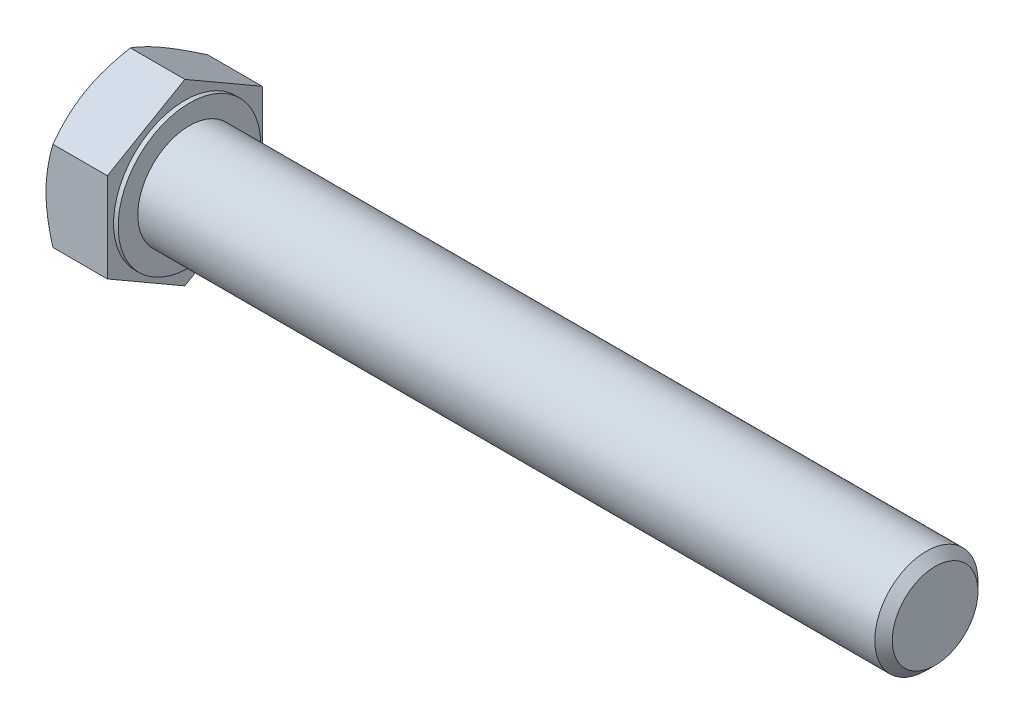
ISO-10303-21;
HEADER;
FILE_DESCRIPTION(('STEP AP214'),'2;1');
FILE_NAME('part.step','',(''),(''),'','','');
FILE_SCHEMA(('AUTOMOTIVE_DESIGN { 1 0 10303 214 1 1 1 1 }'));
ENDSEC;
DATA;
#1=APPLICATION_CONTEXT('core data for automotive mechanical design processes');
#2=APPLICATION_PROTOCOL_DEFINITION('international standard','automotive_design',2000,#1);
#3=PRODUCT_CONTEXT('',#1,'mechanical');
#4=PRODUCT('Part','Part','',(#3));
#5=PRODUCT_RELATED_PRODUCT_CATEGORY('part','',(#4));
#6=PRODUCT_DEFINITION_FORMATION('','',#4);
#7=PRODUCT_DEFINITION_CONTEXT('part definition',#1,'design');
#8=PRODUCT_DEFINITION('design','',#6,#7);
#9=PRODUCT_DEFINITION_SHAPE('','',#8);
#10=(LENGTH_UNIT() NAMED_UNIT(*) SI_UNIT(.MILLI.,.METRE.));
#11=(NAMED_UNIT(*) PLANE_ANGLE_UNIT() SI_UNIT($,.RADIAN.));
#12=(NAMED_UNIT(*) SI_UNIT($,.STERADIAN.) SOLID_ANGLE_UNIT());
#13=UNCERTAINTY_MEASURE_WITH_UNIT(LENGTH_MEASURE(1.E-05),#10,'distance_accuracy_value','');
#14=(GEOMETRIC_REPRESENTATION_CONTEXT(3) GLOBAL_UNCERTAINTY_ASSIGNED_CONTEXT((#13)) GLOBAL_UNIT_ASSIGNED_CONTEXT((#10,
#11,#12)) REPRESENTATION_CONTEXT('',''));
#15=CARTESIAN_POINT('',(0.,0.,0.));
#16=DIRECTION('',(0.,0.,1.));
#17=DIRECTION('',(1.,0.,0.));
#18=AXIS2_PLACEMENT_3D('',#15,#16,#17);
#19=CARTESIAN_POINT('',(-11.5,0.,0.));
#20=DIRECTION('',(1.,0.,0.));
#21=DIRECTION('',(0.,0.,-1.));
#22=AXIS2_PLACEMENT_3D('',#19,#20,#21);
#23=CONICAL_SURFACE('',#22,13.5,1.0471975511966);
#24=CARTESIAN_POINT('',(-10.2942286340602,-15.5884572681199,0.));
#25=CARTESIAN_POINT('',(-11.5,-13.5000000000005,-3.61731409781927));
#26=CARTESIAN_POINT('',(-11.5,-11.6913429510899,-6.75000000000001));
#27=B_SPLINE_CURVE_WITH_KNOTS('',2,(#24,#25,#26),.UNSPECIFIED.,.F.,.F.,(3,3),(0.,1.),.UNSPECIFIED.);
#28=CARTESIAN_POINT('',(-10.29422863406,-15.5884572681199,0.));
#29=VERTEX_POINT('',#28);
#30=CARTESIAN_POINT('',(-11.5,-11.6913429510899,-6.75));
#31=VERTEX_POINT('',#30);
#32=EDGE_CURVE('E417',#29,#31,#27,.T.);
#33=ORIENTED_EDGE('',*,*,#32,.F.);
#34=CARTESIAN_POINT('',(-11.5,-11.6913429510899,6.75));
#35=CARTESIAN_POINT('',(-11.5,-13.5000000000003,3.6173140978196));
#36=CARTESIAN_POINT('',(-10.2942286340601,-15.5884572681199,0.));
#37=B_SPLINE_CURVE_WITH_KNOTS('',2,(#34,#35,#36),.UNSPECIFIED.,.F.,.F.,(3,3),(0.,1.),.UNSPECIFIED.);
#38=CARTESIAN_POINT('',(-11.5,-11.6913429510899,6.75));
#39=VERTEX_POINT('',#38);
#40=EDGE_CURVE('E95',#39,#29,#37,.T.);
#41=ORIENTED_EDGE('',*,*,#40,.F.);
#42=CARTESIAN_POINT('',(-11.5,0.,0.));
#43=DIRECTION('',(1.,0.,0.));
#44=DIRECTION('',(0.,0.,-1.));
#45=AXIS2_PLACEMENT_3D('',#42,#43,#44);
#46=CIRCLE('',#45,13.5);
#47=EDGE_CURVE('E10',#39,#31,#46,.T.);
#48=ORIENTED_EDGE('',*,*,#47,.T.);
#49=EDGE_LOOP('',(#33,#41,#48));
#50=FACE_BOUND('',#49,.T.);
#51=ADVANCED_FACE('F16',(#50),#23,.T.);
#52=CARTESIAN_POINT('',(-11.5,0.,0.));
#53=DIRECTION('',(1.,0.,0.));
#54=DIRECTION('',(0.,1.,0.));
#55=AXIS2_PLACEMENT_3D('',#52,#53,#54);
#56=PLANE('',#55);
#57=CARTESIAN_POINT('',(-11.5,0.,0.));
#58=DIRECTION('',(1.,0.,0.));
#59=DIRECTION('',(0.,0.,-1.));
#60=AXIS2_PLACEMENT_3D('',#57,#58,#59);
#61=CIRCLE('',#60,13.5);
#62=CARTESIAN_POINT('',(-11.5,11.6913429510899,-6.75));
#63=VERTEX_POINT('',#62);
#64=CARTESIAN_POINT('',(-11.5,11.6913429510899,6.75));
#65=VERTEX_POINT('',#64);
#66=EDGE_CURVE('E30',#63,#65,#61,.T.);
#67=ORIENTED_EDGE('',*,*,#66,.F.);
#68=CARTESIAN_POINT('',(-11.5,0.,0.));
#69=DIRECTION('',(1.,0.,0.));
#70=DIRECTION('',(0.,0.,-1.));
#71=AXIS2_PLACEMENT_3D('',#68,#69,#70);
#72=CIRCLE('',#71,13.5);
#73=CARTESIAN_POINT('',(-11.5,0.,-13.5));
#74=VERTEX_POINT('',#73);
#75=EDGE_CURVE('E106',#74,#63,#72,.T.);
#76=ORIENTED_EDGE('',*,*,#75,.F.);
#77=CARTESIAN_POINT('',(-11.5,0.,0.));
#78=DIRECTION('',(1.,0.,0.));
#79=DIRECTION('',(0.,0.,-1.));
#80=AXIS2_PLACEMENT_3D('',#77,#78,#79);
#81=CIRCLE('',#80,13.5);
#82=EDGE_CURVE('E425',#31,#74,#81,.T.);
#83=ORIENTED_EDGE('',*,*,#82,.F.);
#84=ORIENTED_EDGE('',*,*,#47,.F.);
#85=CARTESIAN_POINT('',(-11.5,0.,0.));
#86=DIRECTION('',(1.,0.,0.));
#87=DIRECTION('',(0.,0.,-1.));
#88=AXIS2_PLACEMENT_3D('',#85,#86,#87);
#89=CIRCLE('',#88,13.5);
#90=CARTESIAN_POINT('',(-11.5,0.,13.5));
#91=VERTEX_POINT('',#90);
#92=EDGE_CURVE('E427',#91,#39,#89,.T.);
#93=ORIENTED_EDGE('',*,*,#92,.F.);
#94=CARTESIAN_POINT('',(-11.5,0.,0.));
#95=DIRECTION('',(1.,0.,0.));
#96=DIRECTION('',(0.,0.,-1.));
#97=AXIS2_PLACEMENT_3D('',#94,#95,#96);
#98=CIRCLE('',#97,13.5);
#99=EDGE_CURVE('E360',#65,#91,#98,.T.);
#100=ORIENTED_EDGE('',*,*,#99,.F.);
#101=EDGE_LOOP('',(#67,#76,#83,#84,#93,#100));
#102=FACE_BOUND('',#101,.T.);
#103=ADVANCED_FACE('F204',(#102),#56,.F.);
#104=CARTESIAN_POINT('',(-11.5,0.,0.));
#105=DIRECTION('',(1.,0.,0.));
#106=DIRECTION('',(0.,0.,-1.));
#107=AXIS2_PLACEMENT_3D('',#104,#105,#106);
#108=CONICAL_SURFACE('',#107,13.5,1.0471975511966);
#109=CARTESIAN_POINT('',(-10.2942286340602,15.5884572681199,0.));
#110=CARTESIAN_POINT('',(-11.5,13.5000000000005,3.61731409781927));
#111=CARTESIAN_POINT('',(-11.5,11.6913429510899,6.75000000000001));
#112=B_SPLINE_CURVE_WITH_KNOTS('',2,(#109,#110,#111),.UNSPECIFIED.,.F.,.F.,(3,3),(0.,1.),.UNSPECIFIED.);
#113=CARTESIAN_POINT('',(-10.29422863406,15.5884572681199,0.));
#114=VERTEX_POINT('',#113);
#115=EDGE_CURVE('E313',#114,#65,#112,.T.);
#116=ORIENTED_EDGE('',*,*,#115,.F.);
#117=CARTESIAN_POINT('',(-11.5,11.6913429510899,-6.75));
#118=CARTESIAN_POINT('',(-11.5,13.5000000000003,-3.6173140978196));
#119=CARTESIAN_POINT('',(-10.2942286340601,15.5884572681199,0.));
#120=B_SPLINE_CURVE_WITH_KNOTS('',2,(#117,#118,#119),.UNSPECIFIED.,.F.,.F.,(3,3),(0.,1.),.UNSPECIFIED.);
#121=EDGE_CURVE('E454',#63,#114,#120,.T.);
#122=ORIENTED_EDGE('',*,*,#121,.F.);
#123=ORIENTED_EDGE('',*,*,#66,.T.);
#124=EDGE_LOOP('',(#116,#122,#123));
#125=FACE_BOUND('',#124,.T.);
#126=ADVANCED_FACE('F254',(#125),#108,.T.);
#127=CARTESIAN_POINT('',(-11.5,0.,0.));
#128=DIRECTION('',(1.,0.,0.));
#129=DIRECTION('',(0.,0.,-1.));
#130=AXIS2_PLACEMENT_3D('',#127,#128,#129);
#131=CONICAL_SURFACE('',#130,13.5,1.0471975511966);
#132=CARTESIAN_POINT('',(-10.2942286340602,7.79422863405995,-13.5));
#133=CARTESIAN_POINT('',(-11.5,9.88268590217932,-9.88268590218075));
#134=CARTESIAN_POINT('',(-11.5,11.6913429510899,-6.75));
#135=B_SPLINE_CURVE_WITH_KNOTS('',2,(#132,#133,#134),.UNSPECIFIED.,.F.,.F.,(3,3),(0.,1.),.UNSPECIFIED.);
#136=CARTESIAN_POINT('',(-10.29422863406,7.79422863405995,-13.5));
#137=VERTEX_POINT('',#136);
#138=EDGE_CURVE('E480',#137,#63,#135,.T.);
#139=ORIENTED_EDGE('',*,*,#138,.F.);
#140=CARTESIAN_POINT('',(-11.5,0.,-13.5));
#141=CARTESIAN_POINT('',(-11.5,3.61731409782019,-13.5));
#142=CARTESIAN_POINT('',(-10.29422863406,7.79422863405995,-13.5));
#143=B_SPLINE_CURVE_WITH_KNOTS('',2,(#140,#141,#142),.UNSPECIFIED.,.F.,.F.,(3,3),(0.,1.),.UNSPECIFIED.);
#144=EDGE_CURVE('E226',#74,#137,#143,.T.);
#145=ORIENTED_EDGE('',*,*,#144,.F.);
#146=ORIENTED_EDGE('',*,*,#75,.T.);
#147=EDGE_LOOP('',(#139,#145,#146));
#148=FACE_BOUND('',#147,.T.);
#149=ADVANCED_FACE('F244',(#148),#131,.T.);
#150=CARTESIAN_POINT('',(-11.5,0.,0.));
#151=DIRECTION('',(1.,0.,0.));
#152=DIRECTION('',(0.,0.,-1.));
#153=AXIS2_PLACEMENT_3D('',#150,#151,#152);
#154=CONICAL_SURFACE('',#153,13.5,1.0471975511966);
#155=CARTESIAN_POINT('',(-10.29422863406,-7.79422863405995,-13.5));
#156=CARTESIAN_POINT('',(-11.5,-3.61731409782003,-13.5));
#157=CARTESIAN_POINT('',(-11.5,0.,-13.5));
#158=B_SPLINE_CURVE_WITH_KNOTS('',2,(#155,#156,#157),.UNSPECIFIED.,.F.,.F.,(3,3),(0.,1.),.UNSPECIFIED.);
#159=CARTESIAN_POINT('',(-10.29422863406,-7.79422863405995,-13.5));
#160=VERTEX_POINT('',#159);
#161=EDGE_CURVE('E507',#160,#74,#158,.T.);
#162=ORIENTED_EDGE('',*,*,#161,.F.);
#163=CARTESIAN_POINT('',(-11.5,-11.6913429510899,-6.75000000000001));
#164=CARTESIAN_POINT('',(-11.5,-9.8826859021795,-9.88268590218045));
#165=CARTESIAN_POINT('',(-10.2942286340601,-7.79422863405995,-13.5));
#166=B_SPLINE_CURVE_WITH_KNOTS('',2,(#163,#164,#165),.UNSPECIFIED.,.F.,.F.,(3,3),(0.,1.),.UNSPECIFIED.);
#167=EDGE_CURVE('E388',#31,#160,#166,.T.);
#168=ORIENTED_EDGE('',*,*,#167,.F.);
#169=ORIENTED_EDGE('',*,*,#82,.T.);
#170=EDGE_LOOP('',(#162,#168,#169));
#171=FACE_BOUND('',#170,.T.);
#172=ADVANCED_FACE('F253',(#171),#154,.T.);
#173=CARTESIAN_POINT('',(-11.5,0.,0.));
#174=DIRECTION('',(1.,0.,0.));
#175=DIRECTION('',(0.,0.,-1.));
#176=AXIS2_PLACEMENT_3D('',#173,#174,#175);
#177=CONICAL_SURFACE('',#176,13.5,1.0471975511966);
#178=CARTESIAN_POINT('',(-11.5,0.,13.5));
#179=CARTESIAN_POINT('',(-11.5,-3.61731409782019,13.5));
#180=CARTESIAN_POINT('',(-10.29422863406,-7.79422863405995,13.5));
#181=B_SPLINE_CURVE_WITH_KNOTS('',2,(#178,#179,#180),.UNSPECIFIED.,.F.,.F.,(3,3),(0.,1.),.UNSPECIFIED.);
#182=CARTESIAN_POINT('',(-10.29422863406,-7.79422863405995,13.5));
#183=VERTEX_POINT('',#182);
#184=EDGE_CURVE('E327',#91,#183,#181,.T.);
#185=ORIENTED_EDGE('',*,*,#184,.F.);
#186=ORIENTED_EDGE('',*,*,#92,.T.);
#187=CARTESIAN_POINT('',(-10.2942286340602,-7.79422863405995,13.5));
#188=CARTESIAN_POINT('',(-11.5,-9.88268590217932,9.88268590218075));
#189=CARTESIAN_POINT('',(-11.5,-11.6913429510899,6.75));
#190=B_SPLINE_CURVE_WITH_KNOTS('',2,(#187,#188,#189),.UNSPECIFIED.,.F.,.F.,(3,3),(0.,1.),.UNSPECIFIED.);
#191=EDGE_CURVE('E578',#183,#39,#190,.T.);
#192=ORIENTED_EDGE('',*,*,#191,.F.);
#193=EDGE_LOOP('',(#185,#186,#192));
#194=FACE_BOUND('',#193,.T.);
#195=ADVANCED_FACE('F255',(#194),#177,.T.);
#196=CARTESIAN_POINT('',(-11.5,0.,0.));
#197=DIRECTION('',(1.,0.,0.));
#198=DIRECTION('',(0.,0.,-1.));
#199=AXIS2_PLACEMENT_3D('',#196,#197,#198);
#200=CONICAL_SURFACE('',#199,13.5,1.0471975511966);
#201=CARTESIAN_POINT('',(-11.5,11.6913429510899,6.75000000000001));
#202=CARTESIAN_POINT('',(-11.5,9.8826859021795,9.88268590218045));
#203=CARTESIAN_POINT('',(-10.2942286340601,7.79422863405995,13.5));
#204=B_SPLINE_CURVE_WITH_KNOTS('',2,(#201,#202,#203),.UNSPECIFIED.,.F.,.F.,(3,3),(0.,1.),.UNSPECIFIED.);
#205=CARTESIAN_POINT('',(-10.29422863406,7.79422863405995,13.5));
#206=VERTEX_POINT('',#205);
#207=EDGE_CURVE('E276',#65,#206,#204,.T.);
#208=ORIENTED_EDGE('',*,*,#207,.F.);
#209=ORIENTED_EDGE('',*,*,#99,.T.);
#210=CARTESIAN_POINT('',(-10.29422863406,7.79422863405995,13.5));
#211=CARTESIAN_POINT('',(-11.5,3.61731409782003,13.5));
#212=CARTESIAN_POINT('',(-11.5,0.,13.5));
#213=B_SPLINE_CURVE_WITH_KNOTS('',2,(#210,#211,#212),.UNSPECIFIED.,.F.,.F.,(3,3),(0.,1.),.UNSPECIFIED.);
#214=EDGE_CURVE('E150',#206,#91,#213,.T.);
#215=ORIENTED_EDGE('',*,*,#214,.F.);
#216=EDGE_LOOP('',(#208,#209,#215));
#217=FACE_BOUND('',#216,.T.);
#218=ADVANCED_FACE('F358',(#217),#200,.T.);
#219=CARTESIAN_POINT('',(-11.5,-7.79422863405995,13.5));
#220=DIRECTION('',(0.,-0.866025403784439,0.5));
#221=DIRECTION('',(-1.,0.,0.));
#222=AXIS2_PLACEMENT_3D('',#219,#220,#221);
#223=PLANE('',#222);
#224=ORIENTED_EDGE('',*,*,#191,.T.);
#225=ORIENTED_EDGE('',*,*,#40,.T.);
#226=DIRECTION('',(1.,0.,0.));
#227=VECTOR('',#226,1.);
#228=CARTESIAN_POINT('',(-11.5,-15.5884572681199,0.));
#229=LINE('',#228,#227);
#230=CARTESIAN_POINT('',(-0.8,-15.5884572681199,0.));
#231=VERTEX_POINT('',#230);
#232=EDGE_CURVE('E570',#29,#231,#229,.T.);
#233=ORIENTED_EDGE('',*,*,#232,.T.);
#234=DIRECTION('',(0.,0.5,0.866025403784439));
#235=VECTOR('',#234,1.);
#236=CARTESIAN_POINT('',(-0.8,-6.96634295108992,14.9339400657629));
#237=LINE('',#236,#235);
#238=CARTESIAN_POINT('',(-0.8,-7.79422863405995,13.5));
#239=VERTEX_POINT('',#238);
#240=EDGE_CURVE('E170',#231,#239,#237,.T.);
#241=ORIENTED_EDGE('',*,*,#240,.T.);
#242=DIRECTION('',(1.,0.,0.));
#243=VECTOR('',#242,1.);
#244=CARTESIAN_POINT('',(-11.5,-7.79422863405995,13.5));
#245=LINE('',#244,#243);
#246=EDGE_CURVE('E365',#183,#239,#245,.T.);
#247=ORIENTED_EDGE('',*,*,#246,.F.);
#248=EDGE_LOOP('',(#224,#225,#233,#241,#247));
#249=FACE_BOUND('',#248,.T.);
#250=ADVANCED_FACE('F18',(#249),#223,.T.);
#251=CARTESIAN_POINT('',(-11.5,-15.5884572681199,0.));
#252=DIRECTION('',(0.,-0.866025403784439,-0.5));
#253=DIRECTION('',(0.,0.5,-0.866025403784439));
#254=AXIS2_PLACEMENT_3D('',#251,#252,#253);
#255=PLANE('',#254);
#256=ORIENTED_EDGE('',*,*,#32,.T.);
#257=ORIENTED_EDGE('',*,*,#167,.T.);
#258=DIRECTION('',(1.,0.,0.));
#259=VECTOR('',#258,1.);
#260=CARTESIAN_POINT('',(-11.5,-7.79422863405995,-13.5));
#261=LINE('',#260,#259);
#262=CARTESIAN_POINT('',(-0.8,-7.79422863405995,-13.5));
#263=VERTEX_POINT('',#262);
#264=EDGE_CURVE('E420',#160,#263,#261,.T.);
#265=ORIENTED_EDGE('',*,*,#264,.T.);
#266=DIRECTION('',(0.,-0.5,0.866025403784439));
#267=VECTOR('',#266,1.);
#268=CARTESIAN_POINT('',(-0.8,-6.96634295108992,-14.9339400657629));
#269=LINE('',#268,#267);
#270=EDGE_CURVE('E174',#263,#231,#269,.T.);
#271=ORIENTED_EDGE('',*,*,#270,.T.);
#272=ORIENTED_EDGE('',*,*,#232,.F.);
#273=EDGE_LOOP('',(#256,#257,#265,#271,#272));
#274=FACE_BOUND('',#273,.T.);
#275=ADVANCED_FACE('F395',(#274),#255,.T.);
#276=CARTESIAN_POINT('',(-11.5,-7.79422863405995,-13.5));
#277=DIRECTION('',(0.,0.,-1.));
#278=DIRECTION('',(0.,-1.,0.));
#279=AXIS2_PLACEMENT_3D('',#276,#277,#278);
#280=PLANE('',#279);
#281=ORIENTED_EDGE('',*,*,#161,.T.);
#282=ORIENTED_EDGE('',*,*,#144,.T.);
#283=DIRECTION('',(1.,0.,0.));
#284=VECTOR('',#283,1.);
#285=CARTESIAN_POINT('',(-11.5,7.79422863405995,-13.5));
#286=LINE('',#285,#284);
#287=CARTESIAN_POINT('',(-0.8,7.79422863405995,-13.5));
#288=VERTEX_POINT('',#287);
#289=EDGE_CURVE('E502',#137,#288,#286,.T.);
#290=ORIENTED_EDGE('',*,*,#289,.T.);
#291=DIRECTION('',(0.,-1.,0.));
#292=VECTOR('',#291,1.);
#293=CARTESIAN_POINT('',(-0.8,18.9,-13.5));
#294=LINE('',#293,#292);
#295=EDGE_CURVE('E156',#288,#263,#294,.T.);
#296=ORIENTED_EDGE('',*,*,#295,.T.);
#297=ORIENTED_EDGE('',*,*,#264,.F.);
#298=EDGE_LOOP('',(#281,#282,#290,#296,#297));
#299=FACE_BOUND('',#298,.T.);
#300=ADVANCED_FACE('F205',(#299),#280,.T.);
#301=CARTESIAN_POINT('',(-11.5,7.79422863405995,-13.5));
#302=DIRECTION('',(0.,0.866025403784439,-0.5));
#303=DIRECTION('',(-1.,0.,0.));
#304=AXIS2_PLACEMENT_3D('',#301,#302,#303);
#305=PLANE('',#304);
#306=ORIENTED_EDGE('',*,*,#138,.T.);
#307=ORIENTED_EDGE('',*,*,#121,.T.);
#308=DIRECTION('',(1.,0.,0.));
#309=VECTOR('',#308,1.);
#310=CARTESIAN_POINT('',(-11.5,15.5884572681199,0.));
#311=LINE('',#310,#309);
#312=CARTESIAN_POINT('',(-0.8,15.5884572681199,0.));
#313=VERTEX_POINT('',#312);
#314=EDGE_CURVE('E483',#114,#313,#311,.T.);
#315=ORIENTED_EDGE('',*,*,#314,.T.);
#316=DIRECTION('',(0.,-0.5,-0.866025403784439));
#317=VECTOR('',#316,1.);
#318=CARTESIAN_POINT('',(-0.8,16.4163429510899,1.43394006576295));
#319=LINE('',#318,#317);
#320=EDGE_CURVE('E158',#313,#288,#319,.T.);
#321=ORIENTED_EDGE('',*,*,#320,.T.);
#322=ORIENTED_EDGE('',*,*,#289,.F.);
#323=EDGE_LOOP('',(#306,#307,#315,#321,#322));
#324=FACE_BOUND('',#323,.T.);
#325=ADVANCED_FACE('F293',(#324),#305,.T.);
#326=CARTESIAN_POINT('',(-11.5,15.5884572681199,0.));
#327=DIRECTION('',(0.,0.866025403784439,0.5));
#328=DIRECTION('',(1.,0.,0.));
#329=AXIS2_PLACEMENT_3D('',#326,#327,#328);
#330=PLANE('',#329);
#331=ORIENTED_EDGE('',*,*,#115,.T.);
#332=ORIENTED_EDGE('',*,*,#207,.T.);
#333=DIRECTION('',(1.,0.,0.));
#334=VECTOR('',#333,1.);
#335=CARTESIAN_POINT('',(-11.5,7.79422863405995,13.5));
#336=LINE('',#335,#334);
#337=CARTESIAN_POINT('',(-0.8,7.79422863405995,13.5));
#338=VERTEX_POINT('',#337);
#339=EDGE_CURVE('E369',#206,#338,#336,.T.);
#340=ORIENTED_EDGE('',*,*,#339,.T.);
#341=DIRECTION('',(0.,0.5,-0.866025403784439));
#342=VECTOR('',#341,1.);
#343=CARTESIAN_POINT('',(-0.8,16.4163429510899,-1.43394006576295));
#344=LINE('',#343,#342);
#345=EDGE_CURVE('E162',#338,#313,#344,.T.);
#346=ORIENTED_EDGE('',*,*,#345,.T.);
#347=ORIENTED_EDGE('',*,*,#314,.F.);
#348=EDGE_LOOP('',(#331,#332,#340,#346,#347));
#349=FACE_BOUND('',#348,.T.);
#350=ADVANCED_FACE('F283',(#349),#330,.T.);
#351=CARTESIAN_POINT('',(-11.5,7.79422863405995,13.5));
#352=DIRECTION('',(0.,0.,1.));
#353=DIRECTION('',(1.,0.,0.));
#354=AXIS2_PLACEMENT_3D('',#351,#352,#353);
#355=PLANE('',#354);
#356=ORIENTED_EDGE('',*,*,#214,.T.);
#357=ORIENTED_EDGE('',*,*,#184,.T.);
#358=ORIENTED_EDGE('',*,*,#246,.T.);
#359=DIRECTION('',(0.,1.,0.));
#360=VECTOR('',#359,1.);
#361=CARTESIAN_POINT('',(-0.8,18.9,13.5));
#362=LINE('',#361,#360);
#363=EDGE_CURVE('E166',#239,#338,#362,.T.);
#364=ORIENTED_EDGE('',*,*,#363,.T.);
#365=ORIENTED_EDGE('',*,*,#339,.F.);
#366=EDGE_LOOP('',(#356,#357,#358,#364,#365));
#367=FACE_BOUND('',#366,.T.);
#368=ADVANCED_FACE('F258',(#367),#355,.T.);
#369=CARTESIAN_POINT('',(130.,7.4665,0.));
#370=DIRECTION('',(-1.,0.,0.));
#371=DIRECTION('',(0.,0.,1.));
#372=AXIS2_PLACEMENT_3D('',#369,#370,#371);
#373=PLANE('',#372);
#374=CARTESIAN_POINT('',(130.,0.,0.));
#375=DIRECTION('',(1.,0.,0.));
#376=DIRECTION('',(0.,0.,-1.));
#377=AXIS2_PLACEMENT_3D('',#374,#375,#376);
#378=CIRCLE('',#377,7.4665);
#379=CARTESIAN_POINT('',(130.,0.,-7.4665));
#380=VERTEX_POINT('',#379);
#381=EDGE_CURVE('E142',#380,#380,#378,.T.);
#382=ORIENTED_EDGE('',*,*,#381,.T.);
#383=EDGE_LOOP('',(#382));
#384=FACE_BOUND('',#383,.T.);
#385=ADVANCED_FACE('F404',(#384),#373,.F.);
#386=CARTESIAN_POINT('',(128.4665,0.,0.));
#387=DIRECTION('',(-1.,0.,0.));
#388=DIRECTION('',(0.,0.,1.));
#389=AXIS2_PLACEMENT_3D('',#386,#387,#388);
#390=CONICAL_SURFACE('',#389,9.,0.785398163397451);
#391=CARTESIAN_POINT('',(128.4665,0.,0.));
#392=DIRECTION('',(1.,0.,0.));
#393=DIRECTION('',(0.,0.,-1.));
#394=AXIS2_PLACEMENT_3D('',#391,#392,#393);
#395=CIRCLE('',#394,9.);
#396=CARTESIAN_POINT('',(128.4665,0.,-9.));
#397=VERTEX_POINT('',#396);
#398=EDGE_CURVE('E137',#397,#397,#395,.T.);
#399=ORIENTED_EDGE('',*,*,#398,.T.);
#400=EDGE_LOOP('',(#399));
#401=FACE_BOUND('',#400,.T.);
#402=ORIENTED_EDGE('',*,*,#381,.F.);
#403=EDGE_LOOP('',(#402));
#404=FACE_BOUND('',#403,.T.);
#405=ADVANCED_FACE('F138',(#401,#404),#390,.T.);
#406=CARTESIAN_POINT('',(130.,0.,0.));
#407=DIRECTION('',(1.,0.,0.));
#408=DIRECTION('',(0.,0.,-1.));
#409=AXIS2_PLACEMENT_3D('',#406,#407,#408);
#410=CYLINDRICAL_SURFACE('',#409,9.);
#411=CARTESIAN_POINT('',(0.,0.,0.));
#412=DIRECTION('',(1.,0.,0.));
#413=DIRECTION('',(0.,0.,-1.));
#414=AXIS2_PLACEMENT_3D('',#411,#412,#413);
#415=CIRCLE('',#414,9.);
#416=CARTESIAN_POINT('',(0.,0.,-9.));
#417=VERTEX_POINT('',#416);
#418=EDGE_CURVE('E143',#417,#417,#415,.T.);
#419=ORIENTED_EDGE('',*,*,#418,.T.);
#420=EDGE_LOOP('',(#419));
#421=FACE_BOUND('',#420,.T.);
#422=ORIENTED_EDGE('',*,*,#398,.F.);
#423=EDGE_LOOP('',(#422));
#424=FACE_BOUND('',#423,.T.);
#425=ADVANCED_FACE('F405',(#421,#424),#410,.T.);
#426=CARTESIAN_POINT('',(0.,12.425,0.));
#427=DIRECTION('',(-1.,0.,0.));
#428=DIRECTION('',(0.,0.,1.));
#429=AXIS2_PLACEMENT_3D('',#426,#427,#428);
#430=PLANE('',#429);
#431=CARTESIAN_POINT('',(0.,0.,0.));
#432=DIRECTION('',(1.,0.,0.));
#433=DIRECTION('',(0.,0.,-1.));
#434=AXIS2_PLACEMENT_3D('',#431,#432,#433);
#435=CIRCLE('',#434,12.425);
#436=CARTESIAN_POINT('',(0.,0.,-12.425));
#437=VERTEX_POINT('',#436);
#438=EDGE_CURVE('E152',#437,#437,#435,.T.);
#439=ORIENTED_EDGE('',*,*,#438,.T.);
#440=EDGE_LOOP('',(#439));
#441=FACE_BOUND('',#440,.T.);
#442=ORIENTED_EDGE('',*,*,#418,.F.);
#443=EDGE_LOOP('',(#442));
#444=FACE_BOUND('',#443,.T.);
#445=ADVANCED_FACE('F468',(#441,#444),#430,.F.);
#446=CARTESIAN_POINT('',(130.,0.,0.));
#447=DIRECTION('',(1.,0.,0.));
#448=DIRECTION('',(0.,0.,-1.));
#449=AXIS2_PLACEMENT_3D('',#446,#447,#448);
#450=CYLINDRICAL_SURFACE('',#449,12.425);
#451=CARTESIAN_POINT('',(-0.8,0.,0.));
#452=DIRECTION('',(1.,0.,0.));
#453=DIRECTION('',(0.,0.,-1.));
#454=AXIS2_PLACEMENT_3D('',#451,#452,#453);
#455=CIRCLE('',#454,12.425);
#456=CARTESIAN_POINT('',(-0.8,0.,-12.425));
#457=VERTEX_POINT('',#456);
#458=EDGE_CURVE('E171',#457,#457,#455,.T.);
#459=ORIENTED_EDGE('',*,*,#458,.T.);
#460=EDGE_LOOP('',(#459));
#461=FACE_BOUND('',#460,.T.);
#462=ORIENTED_EDGE('',*,*,#438,.F.);
#463=EDGE_LOOP('',(#462));
#464=FACE_BOUND('',#463,.T.);
#465=ADVANCED_FACE('F295',(#461,#464),#450,.T.);
#466=CARTESIAN_POINT('',(-0.8,18.9,0.));
#467=DIRECTION('',(-1.,0.,0.));
#468=DIRECTION('',(0.,0.,1.));
#469=AXIS2_PLACEMENT_3D('',#466,#467,#468);
#470=PLANE('',#469);
#471=ORIENTED_EDGE('',*,*,#363,.F.);
#472=ORIENTED_EDGE('',*,*,#240,.F.);
#473=ORIENTED_EDGE('',*,*,#270,.F.);
#474=ORIENTED_EDGE('',*,*,#295,.F.);
#475=ORIENTED_EDGE('',*,*,#320,.F.);
#476=ORIENTED_EDGE('',*,*,#345,.F.);
#477=EDGE_LOOP('',(#471,#472,#473,#474,#475,#476));
#478=FACE_BOUND('',#477,.T.);
#479=ORIENTED_EDGE('',*,*,#458,.F.);
#480=EDGE_LOOP('',(#479));
#481=FACE_BOUND('',#480,.T.);
#482=ADVANCED_FACE('F208',(#478,#481),#470,.F.);
#483=CLOSED_SHELL('',(#51,#103,#126,#149,#172,#195,#218,#250,#275,#300,#325,#350,#368,#385,#405,
#425,#445,#465,#482));
#484=MANIFOLD_SOLID_BREP('B1',#483);
#485=ADVANCED_BREP_SHAPE_REPRESENTATION('',(#18,#484),#14);
#486=SHAPE_DEFINITION_REPRESENTATION(#9,#485);
ENDSEC;
END-ISO-10303-21;
